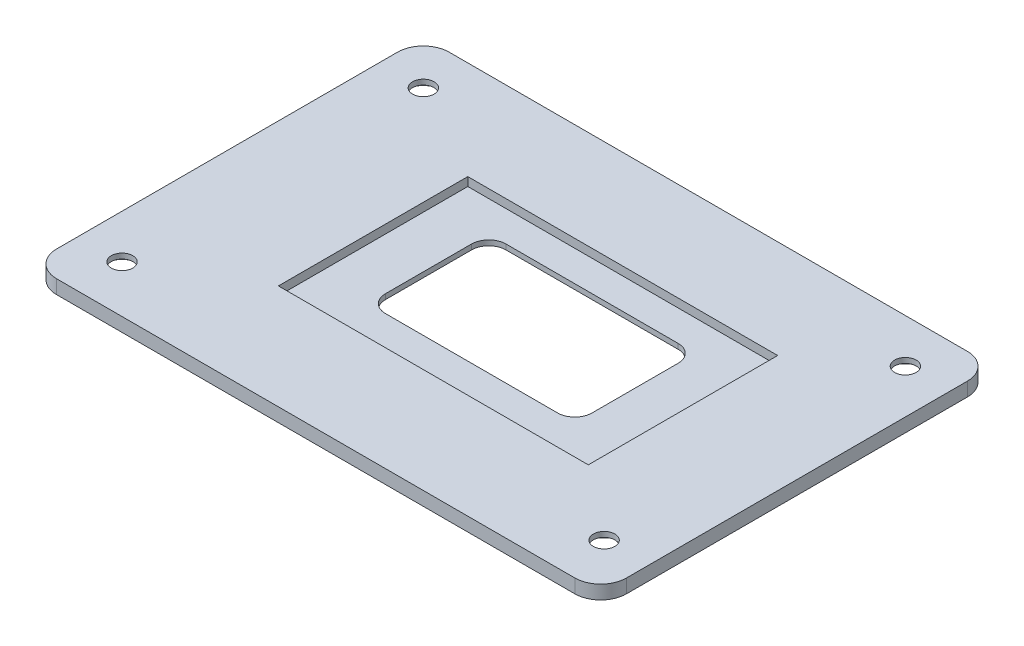
ISO-10303-21;
HEADER;
FILE_DESCRIPTION(('STEP AP214'),'2;1');
FILE_NAME('part.step','',(''),(''),'','','');
FILE_SCHEMA(('AUTOMOTIVE_DESIGN { 1 0 10303 214 1 1 1 1 }'));
ENDSEC;
DATA;
#1=APPLICATION_CONTEXT('core data for automotive mechanical design processes');
#2=APPLICATION_PROTOCOL_DEFINITION('international standard','automotive_design',2000,#1);
#3=PRODUCT_CONTEXT('',#1,'mechanical');
#4=PRODUCT('Part','Part','',(#3));
#5=PRODUCT_RELATED_PRODUCT_CATEGORY('part','',(#4));
#6=PRODUCT_DEFINITION_FORMATION('','',#4);
#7=PRODUCT_DEFINITION_CONTEXT('part definition',#1,'design');
#8=PRODUCT_DEFINITION('design','',#6,#7);
#9=PRODUCT_DEFINITION_SHAPE('','',#8);
#10=(LENGTH_UNIT() NAMED_UNIT(*) SI_UNIT(.MILLI.,.METRE.));
#11=(NAMED_UNIT(*) PLANE_ANGLE_UNIT() SI_UNIT($,.RADIAN.));
#12=(NAMED_UNIT(*) SI_UNIT($,.STERADIAN.) SOLID_ANGLE_UNIT());
#13=UNCERTAINTY_MEASURE_WITH_UNIT(LENGTH_MEASURE(1.E-05),#10,'distance_accuracy_value','');
#14=(GEOMETRIC_REPRESENTATION_CONTEXT(3) GLOBAL_UNCERTAINTY_ASSIGNED_CONTEXT((#13)) GLOBAL_UNIT_ASSIGNED_CONTEXT((#10,
#11,#12)) REPRESENTATION_CONTEXT('',''));
#15=CARTESIAN_POINT('',(0.,0.,0.));
#16=DIRECTION('',(0.,0.,1.));
#17=DIRECTION('',(1.,0.,0.));
#18=AXIS2_PLACEMENT_3D('',#15,#16,#17);
#19=CARTESIAN_POINT('',(30.1,1.6,-19.8));
#20=DIRECTION('',(0.,-1.,0.));
#21=DIRECTION('',(0.,0.,-1.));
#22=AXIS2_PLACEMENT_3D('',#19,#20,#21);
#23=PLANE('',#22);
#24=CARTESIAN_POINT('',(30.1,1.6,-19.8));
#25=DIRECTION('',(0.,1.,0.));
#26=DIRECTION('',(0.,0.,-1.));
#27=AXIS2_PLACEMENT_3D('',#24,#25,#26);
#28=CIRCLE('',#27,3.);
#29=CARTESIAN_POINT('',(33.1,1.6,-19.8));
#30=VERTEX_POINT('',#29);
#31=CARTESIAN_POINT('',(30.1,1.6,-22.8));
#32=VERTEX_POINT('',#31);
#33=EDGE_CURVE('E374',#30,#32,#28,.T.);
#34=ORIENTED_EDGE('',*,*,#33,.T.);
#35=DIRECTION('',(-1.,0.,0.));
#36=VECTOR('',#35,1.);
#37=CARTESIAN_POINT('',(-30.1,1.6,-22.8));
#38=LINE('',#37,#36);
#39=CARTESIAN_POINT('',(-30.1,1.6,-22.8));
#40=VERTEX_POINT('',#39);
#41=EDGE_CURVE('E378',#32,#40,#38,.T.);
#42=ORIENTED_EDGE('',*,*,#41,.T.);
#43=CARTESIAN_POINT('',(-30.1,1.6,-19.8));
#44=DIRECTION('',(0.,1.,0.));
#45=DIRECTION('',(0.,0.,-1.));
#46=AXIS2_PLACEMENT_3D('',#43,#44,#45);
#47=CIRCLE('',#46,3.);
#48=CARTESIAN_POINT('',(-33.1,1.6,-19.8));
#49=VERTEX_POINT('',#48);
#50=EDGE_CURVE('E382',#40,#49,#47,.T.);
#51=ORIENTED_EDGE('',*,*,#50,.T.);
#52=DIRECTION('',(0.,0.,1.));
#53=VECTOR('',#52,1.);
#54=CARTESIAN_POINT('',(-33.1,1.6,19.8));
#55=LINE('',#54,#53);
#56=CARTESIAN_POINT('',(-33.1,1.6,19.8));
#57=VERTEX_POINT('',#56);
#58=EDGE_CURVE('E385',#49,#57,#55,.T.);
#59=ORIENTED_EDGE('',*,*,#58,.T.);
#60=CARTESIAN_POINT('',(-30.1,1.6,19.8));
#61=DIRECTION('',(0.,1.,0.));
#62=DIRECTION('',(0.,0.,-1.));
#63=AXIS2_PLACEMENT_3D('',#60,#61,#62);
#64=CIRCLE('',#63,3.);
#65=CARTESIAN_POINT('',(-30.1,1.6,22.8));
#66=VERTEX_POINT('',#65);
#67=EDGE_CURVE('E388',#57,#66,#64,.T.);
#68=ORIENTED_EDGE('',*,*,#67,.T.);
#69=DIRECTION('',(1.,0.,0.));
#70=VECTOR('',#69,1.);
#71=CARTESIAN_POINT('',(-30.1,1.6,22.8));
#72=LINE('',#71,#70);
#73=CARTESIAN_POINT('',(30.1,1.6,22.8));
#74=VERTEX_POINT('',#73);
#75=EDGE_CURVE('E391',#66,#74,#72,.T.);
#76=ORIENTED_EDGE('',*,*,#75,.T.);
#77=CARTESIAN_POINT('',(30.1,1.6,19.8));
#78=DIRECTION('',(0.,1.,0.));
#79=DIRECTION('',(0.,0.,1.));
#80=AXIS2_PLACEMENT_3D('',#77,#78,#79);
#81=CIRCLE('',#80,3.);
#82=CARTESIAN_POINT('',(33.1,1.6,19.8));
#83=VERTEX_POINT('',#82);
#84=EDGE_CURVE('E394',#74,#83,#81,.T.);
#85=ORIENTED_EDGE('',*,*,#84,.T.);
#86=DIRECTION('',(0.,0.,-1.));
#87=VECTOR('',#86,1.);
#88=CARTESIAN_POINT('',(33.1,1.6,19.8));
#89=LINE('',#88,#87);
#90=EDGE_CURVE('E397',#83,#30,#89,.T.);
#91=ORIENTED_EDGE('',*,*,#90,.T.);
#92=EDGE_LOOP('',(#34,#42,#51,#59,#68,#76,#85,#91));
#93=FACE_BOUND('',#92,.T.);
#94=CARTESIAN_POINT('',(-28.,1.6,-17.7));
#95=DIRECTION('',(0.,-1.,0.));
#96=DIRECTION('',(0.,0.,-1.));
#97=AXIS2_PLACEMENT_3D('',#94,#95,#96);
#98=CIRCLE('',#97,1.25);
#99=CARTESIAN_POINT('',(-28.,1.6,-18.95));
#100=VERTEX_POINT('',#99);
#101=EDGE_CURVE('E273',#100,#100,#98,.F.);
#102=ORIENTED_EDGE('',*,*,#101,.F.);
#103=EDGE_LOOP('',(#102));
#104=FACE_BOUND('',#103,.T.);
#105=CARTESIAN_POINT('',(28.,1.6,-17.7));
#106=DIRECTION('',(0.,-1.,0.));
#107=DIRECTION('',(0.,0.,-1.));
#108=AXIS2_PLACEMENT_3D('',#105,#106,#107);
#109=CIRCLE('',#108,1.25);
#110=CARTESIAN_POINT('',(28.,1.6,-18.95));
#111=VERTEX_POINT('',#110);
#112=EDGE_CURVE('E250',#111,#111,#109,.F.);
#113=ORIENTED_EDGE('',*,*,#112,.F.);
#114=EDGE_LOOP('',(#113));
#115=FACE_BOUND('',#114,.T.);
#116=CARTESIAN_POINT('',(27.9999999999999,1.6,17.3));
#117=DIRECTION('',(0.,-1.,0.));
#118=DIRECTION('',(0.,0.,-1.));
#119=AXIS2_PLACEMENT_3D('',#116,#117,#118);
#120=CIRCLE('',#119,1.25);
#121=CARTESIAN_POINT('',(27.9999999999999,1.6,16.05));
#122=VERTEX_POINT('',#121);
#123=EDGE_CURVE('E251',#122,#122,#120,.F.);
#124=ORIENTED_EDGE('',*,*,#123,.F.);
#125=EDGE_LOOP('',(#124));
#126=FACE_BOUND('',#125,.T.);
#127=CARTESIAN_POINT('',(-28.0000000000001,1.6,17.3));
#128=DIRECTION('',(0.,-1.,0.));
#129=DIRECTION('',(0.,0.,-1.));
#130=AXIS2_PLACEMENT_3D('',#127,#128,#129);
#131=CIRCLE('',#130,1.25);
#132=CARTESIAN_POINT('',(-28.0000000000001,1.6,16.05));
#133=VERTEX_POINT('',#132);
#134=EDGE_CURVE('E260',#133,#133,#131,.F.);
#135=ORIENTED_EDGE('',*,*,#134,.F.);
#136=EDGE_LOOP('',(#135));
#137=FACE_BOUND('',#136,.T.);
#138=DIRECTION('',(1.,0.,0.));
#139=VECTOR('',#138,1.);
#140=CARTESIAN_POINT('',(-16.4990993918296,1.6,-11.3627976285923));
#141=LINE('',#140,#139);
#142=CARTESIAN_POINT('',(-16.4990993918296,1.6,-11.3627976285923));
#143=VERTEX_POINT('',#142);
#144=CARTESIAN_POINT('',(19.5009006081704,1.6,-11.3627976285923));
#145=VERTEX_POINT('',#144);
#146=EDGE_CURVE('E54',#143,#145,#141,.T.);
#147=ORIENTED_EDGE('',*,*,#146,.T.);
#148=DIRECTION('',(0.,0.,-1.));
#149=VECTOR('',#148,1.);
#150=CARTESIAN_POINT('',(19.5009006081704,1.6,10.6372023714077));
#151=LINE('',#150,#149);
#152=CARTESIAN_POINT('',(19.5009006081704,1.6,10.6372023714077));
#153=VERTEX_POINT('',#152);
#154=EDGE_CURVE('E192',#153,#145,#151,.T.);
#155=ORIENTED_EDGE('',*,*,#154,.F.);
#156=DIRECTION('',(1.,0.,0.));
#157=VECTOR('',#156,1.);
#158=CARTESIAN_POINT('',(-16.4990993918296,1.6,10.6372023714077));
#159=LINE('',#158,#157);
#160=CARTESIAN_POINT('',(-16.4990993918296,1.6,10.6372023714077));
#161=VERTEX_POINT('',#160);
#162=EDGE_CURVE('E211',#161,#153,#159,.T.);
#163=ORIENTED_EDGE('',*,*,#162,.F.);
#164=DIRECTION('',(0.,0.,-1.));
#165=VECTOR('',#164,1.);
#166=CARTESIAN_POINT('',(-16.4990993918296,1.6,10.6372023714077));
#167=LINE('',#166,#165);
#168=EDGE_CURVE('E185',#161,#143,#167,.T.);
#169=ORIENTED_EDGE('',*,*,#168,.T.);
#170=EDGE_LOOP('',(#147,#155,#163,#169));
#171=FACE_BOUND('',#170,.T.);
#172=ADVANCED_FACE('F38',(#93,#104,#115,#126,#137,#171),#23,.F.);
#173=CARTESIAN_POINT('',(11.5,-0.000999999999999916,4.2));
#174=DIRECTION('',(0.,1.,0.));
#175=DIRECTION('',(0.,0.,1.));
#176=AXIS2_PLACEMENT_3D('',#173,#174,#175);
#177=CYLINDRICAL_SURFACE('',#176,2.);
#178=CARTESIAN_POINT('',(11.5,0.6,4.2));
#179=DIRECTION('',(0.,1.,0.));
#180=DIRECTION('',(0.,0.,1.));
#181=AXIS2_PLACEMENT_3D('',#178,#179,#180);
#182=CIRCLE('',#181,2.);
#183=CARTESIAN_POINT('',(13.5,0.6,4.2));
#184=VERTEX_POINT('',#183);
#185=CARTESIAN_POINT('',(11.5,0.6,6.2));
#186=VERTEX_POINT('',#185);
#187=EDGE_CURVE('E242',#184,#186,#182,.F.);
#188=ORIENTED_EDGE('',*,*,#187,.F.);
#189=DIRECTION('',(0.,1.,0.));
#190=VECTOR('',#189,1.);
#191=CARTESIAN_POINT('',(13.5,-0.000999999999999916,4.2));
#192=LINE('',#191,#190);
#193=CARTESIAN_POINT('',(13.5,0.,4.2));
#194=VERTEX_POINT('',#193);
#195=EDGE_CURVE('E337',#194,#184,#192,.T.);
#196=ORIENTED_EDGE('',*,*,#195,.F.);
#197=CARTESIAN_POINT('',(11.5,0.,4.2));
#198=DIRECTION('',(0.,-1.,0.));
#199=DIRECTION('',(0.,0.,-1.));
#200=AXIS2_PLACEMENT_3D('',#197,#198,#199);
#201=CIRCLE('',#200,2.);
#202=CARTESIAN_POINT('',(11.5,0.,6.2));
#203=VERTEX_POINT('',#202);
#204=EDGE_CURVE('E333',#203,#194,#201,.F.);
#205=ORIENTED_EDGE('',*,*,#204,.F.);
#206=DIRECTION('',(0.,1.,0.));
#207=VECTOR('',#206,1.);
#208=CARTESIAN_POINT('',(11.5,-0.000999999999999916,6.2));
#209=LINE('',#208,#207);
#210=EDGE_CURVE('E338',#203,#186,#209,.T.);
#211=ORIENTED_EDGE('',*,*,#210,.T.);
#212=EDGE_LOOP('',(#188,#196,#205,#211));
#213=FACE_BOUND('',#212,.T.);
#214=ADVANCED_FACE('F502',(#213),#177,.F.);
#215=CARTESIAN_POINT('',(-8.49999999999999,-0.000999999999999916,6.2));
#216=DIRECTION('',(0.,0.,1.));
#217=DIRECTION('',(1.,0.,0.));
#218=AXIS2_PLACEMENT_3D('',#215,#216,#217);
#219=PLANE('',#218);
#220=DIRECTION('',(-1.,0.,0.));
#221=VECTOR('',#220,1.);
#222=CARTESIAN_POINT('',(-8.49999999999999,0.6,6.2));
#223=LINE('',#222,#221);
#224=CARTESIAN_POINT('',(-8.49999999999999,0.6,6.2));
#225=VERTEX_POINT('',#224);
#226=EDGE_CURVE('E239',#186,#225,#223,.T.);
#227=ORIENTED_EDGE('',*,*,#226,.F.);
#228=ORIENTED_EDGE('',*,*,#210,.F.);
#229=DIRECTION('',(1.,0.,0.));
#230=VECTOR('',#229,1.);
#231=CARTESIAN_POINT('',(-8.49999999999999,0.,6.2));
#232=LINE('',#231,#230);
#233=CARTESIAN_POINT('',(-8.49999999999999,0.,6.2));
#234=VERTEX_POINT('',#233);
#235=EDGE_CURVE('E329',#234,#203,#232,.T.);
#236=ORIENTED_EDGE('',*,*,#235,.F.);
#237=DIRECTION('',(0.,1.,0.));
#238=VECTOR('',#237,1.);
#239=CARTESIAN_POINT('',(-8.49999999999999,-0.000999999999999916,6.2));
#240=LINE('',#239,#238);
#241=EDGE_CURVE('E343',#234,#225,#240,.T.);
#242=ORIENTED_EDGE('',*,*,#241,.T.);
#243=EDGE_LOOP('',(#227,#228,#236,#242));
#244=FACE_BOUND('',#243,.T.);
#245=ADVANCED_FACE('F507',(#244),#219,.F.);
#246=CARTESIAN_POINT('',(-8.49999999999999,-0.000999999999999916,4.2));
#247=DIRECTION('',(0.,1.,0.));
#248=DIRECTION('',(0.,0.,1.));
#249=AXIS2_PLACEMENT_3D('',#246,#247,#248);
#250=CYLINDRICAL_SURFACE('',#249,2.);
#251=CARTESIAN_POINT('',(-8.49999999999999,0.6,4.2));
#252=DIRECTION('',(0.,1.,0.));
#253=DIRECTION('',(0.,0.,1.));
#254=AXIS2_PLACEMENT_3D('',#251,#252,#253);
#255=CIRCLE('',#254,2.);
#256=CARTESIAN_POINT('',(-10.5,0.6,4.2));
#257=VERTEX_POINT('',#256);
#258=EDGE_CURVE('E236',#225,#257,#255,.F.);
#259=ORIENTED_EDGE('',*,*,#258,.F.);
#260=ORIENTED_EDGE('',*,*,#241,.F.);
#261=CARTESIAN_POINT('',(-8.49999999999999,0.,4.2));
#262=DIRECTION('',(0.,-1.,0.));
#263=DIRECTION('',(0.,0.,-1.));
#264=AXIS2_PLACEMENT_3D('',#261,#262,#263);
#265=CIRCLE('',#264,2.);
#266=CARTESIAN_POINT('',(-10.5,0.,4.2));
#267=VERTEX_POINT('',#266);
#268=EDGE_CURVE('E325',#267,#234,#265,.F.);
#269=ORIENTED_EDGE('',*,*,#268,.F.);
#270=DIRECTION('',(0.,1.,0.));
#271=VECTOR('',#270,1.);
#272=CARTESIAN_POINT('',(-10.5,-0.000999999999999916,4.2));
#273=LINE('',#272,#271);
#274=EDGE_CURVE('E347',#267,#257,#273,.T.);
#275=ORIENTED_EDGE('',*,*,#274,.T.);
#276=EDGE_LOOP('',(#259,#260,#269,#275));
#277=FACE_BOUND('',#276,.T.);
#278=ADVANCED_FACE('F688',(#277),#250,.F.);
#279=CARTESIAN_POINT('',(-10.5,-0.000999999999999916,4.2));
#280=DIRECTION('',(-1.,0.,0.));
#281=DIRECTION('',(0.,0.,1.));
#282=AXIS2_PLACEMENT_3D('',#279,#280,#281);
#283=PLANE('',#282);
#284=DIRECTION('',(0.,0.,-1.));
#285=VECTOR('',#284,1.);
#286=CARTESIAN_POINT('',(-10.5,0.6,4.2));
#287=LINE('',#286,#285);
#288=CARTESIAN_POINT('',(-10.5,0.6,-5.8));
#289=VERTEX_POINT('',#288);
#290=EDGE_CURVE('E233',#257,#289,#287,.T.);
#291=ORIENTED_EDGE('',*,*,#290,.F.);
#292=ORIENTED_EDGE('',*,*,#274,.F.);
#293=DIRECTION('',(0.,0.,1.));
#294=VECTOR('',#293,1.);
#295=CARTESIAN_POINT('',(-10.5,0.,4.2));
#296=LINE('',#295,#294);
#297=CARTESIAN_POINT('',(-10.5,0.,-5.8));
#298=VERTEX_POINT('',#297);
#299=EDGE_CURVE('E321',#298,#267,#296,.T.);
#300=ORIENTED_EDGE('',*,*,#299,.F.);
#301=DIRECTION('',(0.,1.,0.));
#302=VECTOR('',#301,1.);
#303=CARTESIAN_POINT('',(-10.5,-0.000999999999999916,-5.8));
#304=LINE('',#303,#302);
#305=EDGE_CURVE('E351',#298,#289,#304,.T.);
#306=ORIENTED_EDGE('',*,*,#305,.T.);
#307=EDGE_LOOP('',(#291,#292,#300,#306));
#308=FACE_BOUND('',#307,.T.);
#309=ADVANCED_FACE('F697',(#308),#283,.F.);
#310=CARTESIAN_POINT('',(-8.49999999999999,-0.000999999999999916,-5.8));
#311=DIRECTION('',(0.,1.,0.));
#312=DIRECTION('',(0.,0.,1.));
#313=AXIS2_PLACEMENT_3D('',#310,#311,#312);
#314=CYLINDRICAL_SURFACE('',#313,2.);
#315=CARTESIAN_POINT('',(-8.49999999999999,0.6,-5.8));
#316=DIRECTION('',(0.,1.,0.));
#317=DIRECTION('',(0.,0.,1.));
#318=AXIS2_PLACEMENT_3D('',#315,#316,#317);
#319=CIRCLE('',#318,2.);
#320=CARTESIAN_POINT('',(-8.49999999999999,0.6,-7.8));
#321=VERTEX_POINT('',#320);
#322=EDGE_CURVE('E230',#289,#321,#319,.F.);
#323=ORIENTED_EDGE('',*,*,#322,.F.);
#324=ORIENTED_EDGE('',*,*,#305,.F.);
#325=CARTESIAN_POINT('',(-8.49999999999999,0.,-5.8));
#326=DIRECTION('',(0.,-1.,0.));
#327=DIRECTION('',(0.,0.,-1.));
#328=AXIS2_PLACEMENT_3D('',#325,#326,#327);
#329=CIRCLE('',#328,2.);
#330=CARTESIAN_POINT('',(-8.49999999999999,0.,-7.8));
#331=VERTEX_POINT('',#330);
#332=EDGE_CURVE('E317',#331,#298,#329,.F.);
#333=ORIENTED_EDGE('',*,*,#332,.F.);
#334=DIRECTION('',(0.,1.,0.));
#335=VECTOR('',#334,1.);
#336=CARTESIAN_POINT('',(-8.49999999999999,-0.000999999999999916,-7.8));
#337=LINE('',#336,#335);
#338=EDGE_CURVE('E355',#331,#321,#337,.T.);
#339=ORIENTED_EDGE('',*,*,#338,.T.);
#340=EDGE_LOOP('',(#323,#324,#333,#339));
#341=FACE_BOUND('',#340,.T.);
#342=ADVANCED_FACE('F706',(#341),#314,.F.);
#343=CARTESIAN_POINT('',(-8.49999999999999,-0.000999999999999916,-7.8));
#344=DIRECTION('',(0.,0.,-1.));
#345=DIRECTION('',(-1.,0.,0.));
#346=AXIS2_PLACEMENT_3D('',#343,#344,#345);
#347=PLANE('',#346);
#348=DIRECTION('',(1.,0.,0.));
#349=VECTOR('',#348,1.);
#350=CARTESIAN_POINT('',(-8.49999999999999,0.6,-7.8));
#351=LINE('',#350,#349);
#352=CARTESIAN_POINT('',(11.5,0.6,-7.8));
#353=VERTEX_POINT('',#352);
#354=EDGE_CURVE('E227',#321,#353,#351,.T.);
#355=ORIENTED_EDGE('',*,*,#354,.F.);
#356=ORIENTED_EDGE('',*,*,#338,.F.);
#357=DIRECTION('',(-1.,0.,0.));
#358=VECTOR('',#357,1.);
#359=CARTESIAN_POINT('',(-8.49999999999999,0.,-7.8));
#360=LINE('',#359,#358);
#361=CARTESIAN_POINT('',(11.5,0.,-7.8));
#362=VERTEX_POINT('',#361);
#363=EDGE_CURVE('E313',#362,#331,#360,.T.);
#364=ORIENTED_EDGE('',*,*,#363,.F.);
#365=DIRECTION('',(0.,1.,0.));
#366=VECTOR('',#365,1.);
#367=CARTESIAN_POINT('',(11.5,-0.000999999999999916,-7.8));
#368=LINE('',#367,#366);
#369=EDGE_CURVE('E359',#362,#353,#368,.T.);
#370=ORIENTED_EDGE('',*,*,#369,.T.);
#371=EDGE_LOOP('',(#355,#356,#364,#370));
#372=FACE_BOUND('',#371,.T.);
#373=ADVANCED_FACE('F715',(#372),#347,.F.);
#374=CARTESIAN_POINT('',(11.5,-0.000999999999999916,-5.8));
#375=DIRECTION('',(0.,1.,0.));
#376=DIRECTION('',(0.,0.,1.));
#377=AXIS2_PLACEMENT_3D('',#374,#375,#376);
#378=CYLINDRICAL_SURFACE('',#377,2.);
#379=CARTESIAN_POINT('',(11.5,0.6,-5.8));
#380=DIRECTION('',(0.,1.,0.));
#381=DIRECTION('',(0.,0.,1.));
#382=AXIS2_PLACEMENT_3D('',#379,#380,#381);
#383=CIRCLE('',#382,2.);
#384=CARTESIAN_POINT('',(13.5,0.6,-5.8));
#385=VERTEX_POINT('',#384);
#386=EDGE_CURVE('E61',#353,#385,#383,.F.);
#387=ORIENTED_EDGE('',*,*,#386,.F.);
#388=ORIENTED_EDGE('',*,*,#369,.F.);
#389=CARTESIAN_POINT('',(11.5,0.,-5.8));
#390=DIRECTION('',(0.,-1.,0.));
#391=DIRECTION('',(0.,0.,-1.));
#392=AXIS2_PLACEMENT_3D('',#389,#390,#391);
#393=CIRCLE('',#392,2.);
#394=CARTESIAN_POINT('',(13.5,0.,-5.8));
#395=VERTEX_POINT('',#394);
#396=EDGE_CURVE('E306',#395,#362,#393,.F.);
#397=ORIENTED_EDGE('',*,*,#396,.F.);
#398=DIRECTION('',(0.,1.,0.));
#399=VECTOR('',#398,1.);
#400=CARTESIAN_POINT('',(13.5,-0.000999999999999916,-5.8));
#401=LINE('',#400,#399);
#402=EDGE_CURVE('E363',#395,#385,#401,.T.);
#403=ORIENTED_EDGE('',*,*,#402,.T.);
#404=EDGE_LOOP('',(#387,#388,#397,#403));
#405=FACE_BOUND('',#404,.T.);
#406=ADVANCED_FACE('F724',(#405),#378,.F.);
#407=CARTESIAN_POINT('',(13.5,-0.000999999999999916,4.2));
#408=DIRECTION('',(1.,0.,0.));
#409=DIRECTION('',(0.,0.,-1.));
#410=AXIS2_PLACEMENT_3D('',#407,#408,#409);
#411=PLANE('',#410);
#412=DIRECTION('',(0.,0.,1.));
#413=VECTOR('',#412,1.);
#414=CARTESIAN_POINT('',(13.5,0.6,4.2));
#415=LINE('',#414,#413);
#416=EDGE_CURVE('E11',#385,#184,#415,.T.);
#417=ORIENTED_EDGE('',*,*,#416,.F.);
#418=ORIENTED_EDGE('',*,*,#402,.F.);
#419=DIRECTION('',(0.,0.,-1.));
#420=VECTOR('',#419,1.);
#421=CARTESIAN_POINT('',(13.5,0.,4.2));
#422=LINE('',#421,#420);
#423=EDGE_CURVE('E342',#194,#395,#422,.T.);
#424=ORIENTED_EDGE('',*,*,#423,.F.);
#425=ORIENTED_EDGE('',*,*,#195,.T.);
#426=EDGE_LOOP('',(#417,#418,#424,#425));
#427=FACE_BOUND('',#426,.T.);
#428=ADVANCED_FACE('F733',(#427),#411,.F.);
#429=CARTESIAN_POINT('',(30.1,1.6,-19.8));
#430=DIRECTION('',(0.,-1.,0.));
#431=DIRECTION('',(0.,0.,-1.));
#432=AXIS2_PLACEMENT_3D('',#429,#430,#431);
#433=CYLINDRICAL_SURFACE('',#432,3.);
#434=CARTESIAN_POINT('',(30.1,0.,-19.8));
#435=DIRECTION('',(0.,1.,0.));
#436=DIRECTION('',(0.,0.,-1.));
#437=AXIS2_PLACEMENT_3D('',#434,#435,#436);
#438=CIRCLE('',#437,3.);
#439=CARTESIAN_POINT('',(33.1,0.,-19.8));
#440=VERTEX_POINT('',#439);
#441=CARTESIAN_POINT('',(30.1,0.,-22.8));
#442=VERTEX_POINT('',#441);
#443=EDGE_CURVE('E373',#440,#442,#438,.T.);
#444=ORIENTED_EDGE('',*,*,#443,.T.);
#445=DIRECTION('',(0.,-1.,0.));
#446=VECTOR('',#445,1.);
#447=CARTESIAN_POINT('',(30.1,1.6,-22.8));
#448=LINE('',#447,#446);
#449=EDGE_CURVE('E47',#32,#442,#448,.T.);
#450=ORIENTED_EDGE('',*,*,#449,.F.);
#451=ORIENTED_EDGE('',*,*,#33,.F.);
#452=DIRECTION('',(0.,-1.,0.));
#453=VECTOR('',#452,1.);
#454=CARTESIAN_POINT('',(33.1,1.6,-19.8));
#455=LINE('',#454,#453);
#456=EDGE_CURVE('E400',#30,#440,#455,.T.);
#457=ORIENTED_EDGE('',*,*,#456,.T.);
#458=EDGE_LOOP('',(#444,#450,#451,#457));
#459=FACE_BOUND('',#458,.T.);
#460=ADVANCED_FACE('F40',(#459),#433,.T.);
#461=CARTESIAN_POINT('',(-30.1,1.6,-22.8));
#462=DIRECTION('',(0.,0.,1.));
#463=DIRECTION('',(1.,0.,0.));
#464=AXIS2_PLACEMENT_3D('',#461,#462,#463);
#465=PLANE('',#464);
#466=DIRECTION('',(-1.,0.,0.));
#467=VECTOR('',#466,1.);
#468=CARTESIAN_POINT('',(-30.1,0.,-22.8));
#469=LINE('',#468,#467);
#470=CARTESIAN_POINT('',(-30.1,0.,-22.8));
#471=VERTEX_POINT('',#470);
#472=EDGE_CURVE('E404',#442,#471,#469,.T.);
#473=ORIENTED_EDGE('',*,*,#472,.T.);
#474=DIRECTION('',(0.,-1.,0.));
#475=VECTOR('',#474,1.);
#476=CARTESIAN_POINT('',(-30.1,1.6,-22.8));
#477=LINE('',#476,#475);
#478=EDGE_CURVE('E447',#40,#471,#477,.T.);
#479=ORIENTED_EDGE('',*,*,#478,.F.);
#480=ORIENTED_EDGE('',*,*,#41,.F.);
#481=ORIENTED_EDGE('',*,*,#449,.T.);
#482=EDGE_LOOP('',(#473,#479,#480,#481));
#483=FACE_BOUND('',#482,.T.);
#484=ADVANCED_FACE('F454',(#483),#465,.F.);
#485=CARTESIAN_POINT('',(-30.1,1.6,-19.8));
#486=DIRECTION('',(0.,-1.,0.));
#487=DIRECTION('',(0.,0.,-1.));
#488=AXIS2_PLACEMENT_3D('',#485,#486,#487);
#489=CYLINDRICAL_SURFACE('',#488,3.);
#490=CARTESIAN_POINT('',(-30.1,0.,-19.8));
#491=DIRECTION('',(0.,1.,0.));
#492=DIRECTION('',(0.,0.,-1.));
#493=AXIS2_PLACEMENT_3D('',#490,#491,#492);
#494=CIRCLE('',#493,3.);
#495=CARTESIAN_POINT('',(-33.1,0.,-19.8));
#496=VERTEX_POINT('',#495);
#497=EDGE_CURVE('E407',#471,#496,#494,.T.);
#498=ORIENTED_EDGE('',*,*,#497,.T.);
#499=DIRECTION('',(0.,-1.,0.));
#500=VECTOR('',#499,1.);
#501=CARTESIAN_POINT('',(-33.1,1.6,-19.8));
#502=LINE('',#501,#500);
#503=EDGE_CURVE('E443',#49,#496,#502,.T.);
#504=ORIENTED_EDGE('',*,*,#503,.F.);
#505=ORIENTED_EDGE('',*,*,#50,.F.);
#506=ORIENTED_EDGE('',*,*,#478,.T.);
#507=EDGE_LOOP('',(#498,#504,#505,#506));
#508=FACE_BOUND('',#507,.T.);
#509=ADVANCED_FACE('F469',(#508),#489,.T.);
#510=CARTESIAN_POINT('',(-33.1,1.6,19.8));
#511=DIRECTION('',(1.,0.,0.));
#512=DIRECTION('',(0.,0.,-1.));
#513=AXIS2_PLACEMENT_3D('',#510,#511,#512);
#514=PLANE('',#513);
#515=DIRECTION('',(0.,0.,1.));
#516=VECTOR('',#515,1.);
#517=CARTESIAN_POINT('',(-33.1,0.,19.8));
#518=LINE('',#517,#516);
#519=CARTESIAN_POINT('',(-33.1,0.,19.8));
#520=VERTEX_POINT('',#519);
#521=EDGE_CURVE('E410',#496,#520,#518,.T.);
#522=ORIENTED_EDGE('',*,*,#521,.T.);
#523=DIRECTION('',(0.,-1.,0.));
#524=VECTOR('',#523,1.);
#525=CARTESIAN_POINT('',(-33.1,1.6,19.8));
#526=LINE('',#525,#524);
#527=EDGE_CURVE('E439',#57,#520,#526,.T.);
#528=ORIENTED_EDGE('',*,*,#527,.F.);
#529=ORIENTED_EDGE('',*,*,#58,.F.);
#530=ORIENTED_EDGE('',*,*,#503,.T.);
#531=EDGE_LOOP('',(#522,#528,#529,#530));
#532=FACE_BOUND('',#531,.T.);
#533=ADVANCED_FACE('F473',(#532),#514,.F.);
#534=CARTESIAN_POINT('',(-30.1,1.6,19.8));
#535=DIRECTION('',(0.,-1.,0.));
#536=DIRECTION('',(0.,0.,-1.));
#537=AXIS2_PLACEMENT_3D('',#534,#535,#536);
#538=CYLINDRICAL_SURFACE('',#537,3.);
#539=CARTESIAN_POINT('',(-30.1,0.,19.8));
#540=DIRECTION('',(0.,1.,0.));
#541=DIRECTION('',(0.,0.,-1.));
#542=AXIS2_PLACEMENT_3D('',#539,#540,#541);
#543=CIRCLE('',#542,3.);
#544=CARTESIAN_POINT('',(-30.1,0.,22.8));
#545=VERTEX_POINT('',#544);
#546=EDGE_CURVE('E413',#520,#545,#543,.T.);
#547=ORIENTED_EDGE('',*,*,#546,.T.);
#548=DIRECTION('',(0.,-1.,0.));
#549=VECTOR('',#548,1.);
#550=CARTESIAN_POINT('',(-30.1,1.6,22.8));
#551=LINE('',#550,#549);
#552=EDGE_CURVE('E435',#66,#545,#551,.T.);
#553=ORIENTED_EDGE('',*,*,#552,.F.);
#554=ORIENTED_EDGE('',*,*,#67,.F.);
#555=ORIENTED_EDGE('',*,*,#527,.T.);
#556=EDGE_LOOP('',(#547,#553,#554,#555));
#557=FACE_BOUND('',#556,.T.);
#558=ADVANCED_FACE('F492',(#557),#538,.T.);
#559=CARTESIAN_POINT('',(-30.1,1.6,22.8));
#560=DIRECTION('',(0.,0.,-1.));
#561=DIRECTION('',(-1.,0.,0.));
#562=AXIS2_PLACEMENT_3D('',#559,#560,#561);
#563=PLANE('',#562);
#564=DIRECTION('',(1.,0.,0.));
#565=VECTOR('',#564,1.);
#566=CARTESIAN_POINT('',(-30.1,0.,22.8));
#567=LINE('',#566,#565);
#568=CARTESIAN_POINT('',(30.1,0.,22.8));
#569=VERTEX_POINT('',#568);
#570=EDGE_CURVE('E416',#545,#569,#567,.T.);
#571=ORIENTED_EDGE('',*,*,#570,.T.);
#572=DIRECTION('',(0.,-1.,0.));
#573=VECTOR('',#572,1.);
#574=CARTESIAN_POINT('',(30.1,1.6,22.8));
#575=LINE('',#574,#573);
#576=EDGE_CURVE('E431',#74,#569,#575,.T.);
#577=ORIENTED_EDGE('',*,*,#576,.F.);
#578=ORIENTED_EDGE('',*,*,#75,.F.);
#579=ORIENTED_EDGE('',*,*,#552,.T.);
#580=EDGE_LOOP('',(#571,#577,#578,#579));
#581=FACE_BOUND('',#580,.T.);
#582=ADVANCED_FACE('F489',(#581),#563,.F.);
#583=CARTESIAN_POINT('',(30.1,1.6,19.8));
#584=DIRECTION('',(0.,-1.,0.));
#585=DIRECTION('',(0.,0.,-1.));
#586=AXIS2_PLACEMENT_3D('',#583,#584,#585);
#587=CYLINDRICAL_SURFACE('',#586,3.);
#588=CARTESIAN_POINT('',(30.1,0.,19.8));
#589=DIRECTION('',(0.,1.,0.));
#590=DIRECTION('',(0.,0.,1.));
#591=AXIS2_PLACEMENT_3D('',#588,#589,#590);
#592=CIRCLE('',#591,3.);
#593=CARTESIAN_POINT('',(33.1,0.,19.8));
#594=VERTEX_POINT('',#593);
#595=EDGE_CURVE('E419',#569,#594,#592,.T.);
#596=ORIENTED_EDGE('',*,*,#595,.T.);
#597=DIRECTION('',(0.,-1.,0.));
#598=VECTOR('',#597,1.);
#599=CARTESIAN_POINT('',(33.1,1.6,19.8));
#600=LINE('',#599,#598);
#601=EDGE_CURVE('E427',#83,#594,#600,.T.);
#602=ORIENTED_EDGE('',*,*,#601,.F.);
#603=ORIENTED_EDGE('',*,*,#84,.F.);
#604=ORIENTED_EDGE('',*,*,#576,.T.);
#605=EDGE_LOOP('',(#596,#602,#603,#604));
#606=FACE_BOUND('',#605,.T.);
#607=ADVANCED_FACE('F485',(#606),#587,.T.);
#608=CARTESIAN_POINT('',(33.1,1.6,19.8));
#609=DIRECTION('',(-1.,0.,0.));
#610=DIRECTION('',(0.,0.,1.));
#611=AXIS2_PLACEMENT_3D('',#608,#609,#610);
#612=PLANE('',#611);
#613=DIRECTION('',(0.,0.,-1.));
#614=VECTOR('',#613,1.);
#615=CARTESIAN_POINT('',(33.1,0.,19.8));
#616=LINE('',#615,#614);
#617=EDGE_CURVE('E379',#594,#440,#616,.T.);
#618=ORIENTED_EDGE('',*,*,#617,.T.);
#619=ORIENTED_EDGE('',*,*,#456,.F.);
#620=ORIENTED_EDGE('',*,*,#90,.F.);
#621=ORIENTED_EDGE('',*,*,#601,.T.);
#622=EDGE_LOOP('',(#618,#619,#620,#621));
#623=FACE_BOUND('',#622,.T.);
#624=ADVANCED_FACE('F483',(#623),#612,.F.);
#625=CARTESIAN_POINT('',(30.1,0.,-19.8));
#626=DIRECTION('',(0.,-1.,0.));
#627=DIRECTION('',(0.,0.,-1.));
#628=AXIS2_PLACEMENT_3D('',#625,#626,#627);
#629=PLANE('',#628);
#630=CARTESIAN_POINT('',(-28.0000000000001,0.,17.3));
#631=DIRECTION('',(0.,-1.,0.));
#632=DIRECTION('',(0.,0.,-1.));
#633=AXIS2_PLACEMENT_3D('',#630,#631,#632);
#634=CIRCLE('',#633,2.6);
#635=CARTESIAN_POINT('',(-28.0000000000001,0.,14.7));
#636=VERTEX_POINT('',#635);
#637=EDGE_CURVE('E277',#636,#636,#634,.T.);
#638=ORIENTED_EDGE('',*,*,#637,.F.);
#639=EDGE_LOOP('',(#638));
#640=FACE_BOUND('',#639,.T.);
#641=CARTESIAN_POINT('',(27.9999999999999,0.,17.3));
#642=DIRECTION('',(0.,-1.,0.));
#643=DIRECTION('',(0.,0.,-1.));
#644=AXIS2_PLACEMENT_3D('',#641,#642,#643);
#645=CIRCLE('',#644,2.6);
#646=CARTESIAN_POINT('',(27.9999999999999,0.,14.7));
#647=VERTEX_POINT('',#646);
#648=EDGE_CURVE('E291',#647,#647,#645,.T.);
#649=ORIENTED_EDGE('',*,*,#648,.F.);
#650=EDGE_LOOP('',(#649));
#651=FACE_BOUND('',#650,.T.);
#652=CARTESIAN_POINT('',(28.,0.,-17.7));
#653=DIRECTION('',(0.,-1.,0.));
#654=DIRECTION('',(0.,0.,-1.));
#655=AXIS2_PLACEMENT_3D('',#652,#653,#654);
#656=CIRCLE('',#655,2.6);
#657=CARTESIAN_POINT('',(28.,0.,-20.3));
#658=VERTEX_POINT('',#657);
#659=EDGE_CURVE('E283',#658,#658,#656,.T.);
#660=ORIENTED_EDGE('',*,*,#659,.F.);
#661=EDGE_LOOP('',(#660));
#662=FACE_BOUND('',#661,.T.);
#663=CARTESIAN_POINT('',(-28.,0.,-17.7));
#664=DIRECTION('',(0.,-1.,0.));
#665=DIRECTION('',(0.,0.,-1.));
#666=AXIS2_PLACEMENT_3D('',#663,#664,#665);
#667=CIRCLE('',#666,2.6);
#668=CARTESIAN_POINT('',(-28.,0.,-20.3));
#669=VERTEX_POINT('',#668);
#670=EDGE_CURVE('E282',#669,#669,#667,.T.);
#671=ORIENTED_EDGE('',*,*,#670,.F.);
#672=EDGE_LOOP('',(#671));
#673=FACE_BOUND('',#672,.T.);
#674=ORIENTED_EDGE('',*,*,#204,.T.);
#675=ORIENTED_EDGE('',*,*,#423,.T.);
#676=ORIENTED_EDGE('',*,*,#396,.T.);
#677=ORIENTED_EDGE('',*,*,#363,.T.);
#678=ORIENTED_EDGE('',*,*,#332,.T.);
#679=ORIENTED_EDGE('',*,*,#299,.T.);
#680=ORIENTED_EDGE('',*,*,#268,.T.);
#681=ORIENTED_EDGE('',*,*,#235,.T.);
#682=EDGE_LOOP('',(#674,#675,#676,#677,#678,#679,#680,#681));
#683=FACE_BOUND('',#682,.T.);
#684=ORIENTED_EDGE('',*,*,#443,.F.);
#685=ORIENTED_EDGE('',*,*,#617,.F.);
#686=ORIENTED_EDGE('',*,*,#595,.F.);
#687=ORIENTED_EDGE('',*,*,#570,.F.);
#688=ORIENTED_EDGE('',*,*,#546,.F.);
#689=ORIENTED_EDGE('',*,*,#521,.F.);
#690=ORIENTED_EDGE('',*,*,#497,.F.);
#691=ORIENTED_EDGE('',*,*,#472,.F.);
#692=EDGE_LOOP('',(#684,#685,#686,#687,#688,#689,#690,#691));
#693=FACE_BOUND('',#692,.T.);
#694=ADVANCED_FACE('F462',(#640,#651,#662,#673,#683,#693),#629,.T.);
#695=CARTESIAN_POINT('',(-28.,1.,-17.7));
#696=DIRECTION('',(0.,-1.,0.));
#697=DIRECTION('',(0.,0.,-1.));
#698=AXIS2_PLACEMENT_3D('',#695,#696,#697);
#699=CYLINDRICAL_SURFACE('',#698,2.6);
#700=CARTESIAN_POINT('',(-28.,1.,-17.7));
#701=DIRECTION('',(0.,-1.,0.));
#702=DIRECTION('',(0.,0.,-1.));
#703=AXIS2_PLACEMENT_3D('',#700,#701,#702);
#704=CIRCLE('',#703,2.6);
#705=CARTESIAN_POINT('',(-28.,1.,-20.3));
#706=VERTEX_POINT('',#705);
#707=EDGE_CURVE('E302',#706,#706,#704,.T.);
#708=ORIENTED_EDGE('',*,*,#707,.F.);
#709=EDGE_LOOP('',(#708));
#710=FACE_BOUND('',#709,.T.);
#711=ORIENTED_EDGE('',*,*,#670,.T.);
#712=EDGE_LOOP('',(#711));
#713=FACE_BOUND('',#712,.T.);
#714=ADVANCED_FACE('F514',(#710,#713),#699,.F.);
#715=CARTESIAN_POINT('',(-28.,1.,-17.7));
#716=DIRECTION('',(0.,-1.,0.));
#717=DIRECTION('',(0.,0.,-1.));
#718=AXIS2_PLACEMENT_3D('',#715,#716,#717);
#719=PLANE('',#718);
#720=CARTESIAN_POINT('',(-28.,1.,-17.7));
#721=DIRECTION('',(0.,-1.,0.));
#722=DIRECTION('',(0.,0.,-1.));
#723=AXIS2_PLACEMENT_3D('',#720,#721,#722);
#724=CIRCLE('',#723,1.25);
#725=CARTESIAN_POINT('',(-28.,1.,-18.95));
#726=VERTEX_POINT('',#725);
#727=EDGE_CURVE('E255',#726,#726,#724,.T.);
#728=ORIENTED_EDGE('',*,*,#727,.F.);
#729=EDGE_LOOP('',(#728));
#730=FACE_BOUND('',#729,.T.);
#731=ORIENTED_EDGE('',*,*,#707,.T.);
#732=EDGE_LOOP('',(#731));
#733=FACE_BOUND('',#732,.T.);
#734=ADVANCED_FACE('F537',(#730,#733),#719,.T.);
#735=CARTESIAN_POINT('',(28.,1.,-17.7));
#736=DIRECTION('',(0.,-1.,0.));
#737=DIRECTION('',(0.,0.,-1.));
#738=AXIS2_PLACEMENT_3D('',#735,#736,#737);
#739=CYLINDRICAL_SURFACE('',#738,2.6);
#740=CARTESIAN_POINT('',(28.,1.,-17.7));
#741=DIRECTION('',(0.,-1.,0.));
#742=DIRECTION('',(0.,0.,-1.));
#743=AXIS2_PLACEMENT_3D('',#740,#741,#742);
#744=CIRCLE('',#743,2.6);
#745=CARTESIAN_POINT('',(28.,1.,-20.3));
#746=VERTEX_POINT('',#745);
#747=EDGE_CURVE('E278',#746,#746,#744,.T.);
#748=ORIENTED_EDGE('',*,*,#747,.F.);
#749=EDGE_LOOP('',(#748));
#750=FACE_BOUND('',#749,.T.);
#751=ORIENTED_EDGE('',*,*,#659,.T.);
#752=EDGE_LOOP('',(#751));
#753=FACE_BOUND('',#752,.T.);
#754=ADVANCED_FACE('F546',(#750,#753),#739,.F.);
#755=CARTESIAN_POINT('',(28.,1.,-17.7));
#756=DIRECTION('',(0.,-1.,0.));
#757=DIRECTION('',(0.,0.,-1.));
#758=AXIS2_PLACEMENT_3D('',#755,#756,#757);
#759=PLANE('',#758);
#760=CARTESIAN_POINT('',(28.,1.,-17.7));
#761=DIRECTION('',(0.,-1.,0.));
#762=DIRECTION('',(0.,0.,-1.));
#763=AXIS2_PLACEMENT_3D('',#760,#761,#762);
#764=CIRCLE('',#763,1.25);
#765=CARTESIAN_POINT('',(28.,1.,-18.95));
#766=VERTEX_POINT('',#765);
#767=EDGE_CURVE('E246',#766,#766,#764,.T.);
#768=ORIENTED_EDGE('',*,*,#767,.F.);
#769=EDGE_LOOP('',(#768));
#770=FACE_BOUND('',#769,.T.);
#771=ORIENTED_EDGE('',*,*,#747,.T.);
#772=EDGE_LOOP('',(#771));
#773=FACE_BOUND('',#772,.T.);
#774=ADVANCED_FACE('F555',(#770,#773),#759,.T.);
#775=CARTESIAN_POINT('',(27.9999999999999,1.,17.3));
#776=DIRECTION('',(0.,-1.,0.));
#777=DIRECTION('',(0.,0.,-1.));
#778=AXIS2_PLACEMENT_3D('',#775,#776,#777);
#779=CYLINDRICAL_SURFACE('',#778,2.6);
#780=CARTESIAN_POINT('',(27.9999999999999,1.,17.3));
#781=DIRECTION('',(0.,-1.,0.));
#782=DIRECTION('',(0.,0.,-1.));
#783=AXIS2_PLACEMENT_3D('',#780,#781,#782);
#784=CIRCLE('',#783,2.6);
#785=CARTESIAN_POINT('',(27.9999999999999,1.,14.7));
#786=VERTEX_POINT('',#785);
#787=EDGE_CURVE('E287',#786,#786,#784,.T.);
#788=ORIENTED_EDGE('',*,*,#787,.F.);
#789=EDGE_LOOP('',(#788));
#790=FACE_BOUND('',#789,.T.);
#791=ORIENTED_EDGE('',*,*,#648,.T.);
#792=EDGE_LOOP('',(#791));
#793=FACE_BOUND('',#792,.T.);
#794=ADVANCED_FACE('F563',(#790,#793),#779,.F.);
#795=CARTESIAN_POINT('',(27.9999999999999,1.,17.3));
#796=DIRECTION('',(0.,-1.,0.));
#797=DIRECTION('',(0.,0.,-1.));
#798=AXIS2_PLACEMENT_3D('',#795,#796,#797);
#799=PLANE('',#798);
#800=CARTESIAN_POINT('',(27.9999999999999,1.,17.3));
#801=DIRECTION('',(0.,-1.,0.));
#802=DIRECTION('',(0.,0.,-1.));
#803=AXIS2_PLACEMENT_3D('',#800,#801,#802);
#804=CIRCLE('',#803,1.25);
#805=CARTESIAN_POINT('',(27.9999999999999,1.,16.05));
#806=VERTEX_POINT('',#805);
#807=EDGE_CURVE('E256',#806,#806,#804,.T.);
#808=ORIENTED_EDGE('',*,*,#807,.F.);
#809=EDGE_LOOP('',(#808));
#810=FACE_BOUND('',#809,.T.);
#811=ORIENTED_EDGE('',*,*,#787,.T.);
#812=EDGE_LOOP('',(#811));
#813=FACE_BOUND('',#812,.T.);
#814=ADVANCED_FACE('F571',(#810,#813),#799,.T.);
#815=CARTESIAN_POINT('',(-28.0000000000001,1.,17.3));
#816=DIRECTION('',(0.,-1.,0.));
#817=DIRECTION('',(0.,0.,-1.));
#818=AXIS2_PLACEMENT_3D('',#815,#816,#817);
#819=CYLINDRICAL_SURFACE('',#818,2.6);
#820=CARTESIAN_POINT('',(-28.0000000000001,1.,17.3));
#821=DIRECTION('',(0.,-1.,0.));
#822=DIRECTION('',(0.,0.,-1.));
#823=AXIS2_PLACEMENT_3D('',#820,#821,#822);
#824=CIRCLE('',#823,2.6);
#825=CARTESIAN_POINT('',(-28.0000000000001,1.,14.7));
#826=VERTEX_POINT('',#825);
#827=EDGE_CURVE('E295',#826,#826,#824,.T.);
#828=ORIENTED_EDGE('',*,*,#827,.F.);
#829=EDGE_LOOP('',(#828));
#830=FACE_BOUND('',#829,.T.);
#831=ORIENTED_EDGE('',*,*,#637,.T.);
#832=EDGE_LOOP('',(#831));
#833=FACE_BOUND('',#832,.T.);
#834=ADVANCED_FACE('F578',(#830,#833),#819,.F.);
#835=CARTESIAN_POINT('',(-28.0000000000001,1.,17.3));
#836=DIRECTION('',(0.,-1.,0.));
#837=DIRECTION('',(0.,0.,-1.));
#838=AXIS2_PLACEMENT_3D('',#835,#836,#837);
#839=PLANE('',#838);
#840=CARTESIAN_POINT('',(-28.0000000000001,1.,17.3));
#841=DIRECTION('',(0.,-1.,0.));
#842=DIRECTION('',(0.,0.,-1.));
#843=AXIS2_PLACEMENT_3D('',#840,#841,#842);
#844=CIRCLE('',#843,1.25);
#845=CARTESIAN_POINT('',(-28.0000000000001,1.,16.05));
#846=VERTEX_POINT('',#845);
#847=EDGE_CURVE('E245',#846,#846,#844,.T.);
#848=ORIENTED_EDGE('',*,*,#847,.F.);
#849=EDGE_LOOP('',(#848));
#850=FACE_BOUND('',#849,.T.);
#851=ORIENTED_EDGE('',*,*,#827,.T.);
#852=EDGE_LOOP('',(#851));
#853=FACE_BOUND('',#852,.T.);
#854=ADVANCED_FACE('F586',(#850,#853),#839,.T.);
#855=CARTESIAN_POINT('',(-28.,1.601,-17.7));
#856=DIRECTION('',(0.,-1.,0.));
#857=DIRECTION('',(0.,0.,-1.));
#858=AXIS2_PLACEMENT_3D('',#855,#856,#857);
#859=CYLINDRICAL_SURFACE('',#858,1.25);
#860=ORIENTED_EDGE('',*,*,#727,.T.);
#861=EDGE_LOOP('',(#860));
#862=FACE_BOUND('',#861,.T.);
#863=ORIENTED_EDGE('',*,*,#101,.T.);
#864=EDGE_LOOP('',(#863));
#865=FACE_BOUND('',#864,.T.);
#866=ADVANCED_FACE('F593',(#862,#865),#859,.F.);
#867=CARTESIAN_POINT('',(28.,1.601,-17.7));
#868=DIRECTION('',(0.,-1.,0.));
#869=DIRECTION('',(0.,0.,-1.));
#870=AXIS2_PLACEMENT_3D('',#867,#868,#869);
#871=CYLINDRICAL_SURFACE('',#870,1.25);
#872=ORIENTED_EDGE('',*,*,#767,.T.);
#873=EDGE_LOOP('',(#872));
#874=FACE_BOUND('',#873,.T.);
#875=ORIENTED_EDGE('',*,*,#112,.T.);
#876=EDGE_LOOP('',(#875));
#877=FACE_BOUND('',#876,.T.);
#878=ADVANCED_FACE('F601',(#874,#877),#871,.F.);
#879=CARTESIAN_POINT('',(27.9999999999999,1.601,17.3));
#880=DIRECTION('',(0.,-1.,0.));
#881=DIRECTION('',(0.,0.,-1.));
#882=AXIS2_PLACEMENT_3D('',#879,#880,#881);
#883=CYLINDRICAL_SURFACE('',#882,1.25);
#884=ORIENTED_EDGE('',*,*,#807,.T.);
#885=EDGE_LOOP('',(#884));
#886=FACE_BOUND('',#885,.T.);
#887=ORIENTED_EDGE('',*,*,#123,.T.);
#888=EDGE_LOOP('',(#887));
#889=FACE_BOUND('',#888,.T.);
#890=ADVANCED_FACE('F609',(#886,#889),#883,.F.);
#891=CARTESIAN_POINT('',(-28.0000000000001,1.601,17.3));
#892=DIRECTION('',(0.,-1.,0.));
#893=DIRECTION('',(0.,0.,-1.));
#894=AXIS2_PLACEMENT_3D('',#891,#892,#893);
#895=CYLINDRICAL_SURFACE('',#894,1.25);
#896=ORIENTED_EDGE('',*,*,#847,.T.);
#897=EDGE_LOOP('',(#896));
#898=FACE_BOUND('',#897,.T.);
#899=ORIENTED_EDGE('',*,*,#134,.T.);
#900=EDGE_LOOP('',(#899));
#901=FACE_BOUND('',#900,.T.);
#902=ADVANCED_FACE('F617',(#898,#901),#895,.F.);
#903=CARTESIAN_POINT('',(0.,0.6,0.));
#904=DIRECTION('',(0.,1.,0.));
#905=DIRECTION('',(0.,0.,1.));
#906=AXIS2_PLACEMENT_3D('',#903,#904,#905);
#907=PLANE('',#906);
#908=DIRECTION('',(1.,0.,0.));
#909=VECTOR('',#908,1.);
#910=CARTESIAN_POINT('',(-16.4990993918296,0.6,-11.3627976285923));
#911=LINE('',#910,#909);
#912=CARTESIAN_POINT('',(-16.4990993918296,0.6,-11.3627976285923));
#913=VERTEX_POINT('',#912);
#914=CARTESIAN_POINT('',(19.5009006081704,0.6,-11.3627976285923));
#915=VERTEX_POINT('',#914);
#916=EDGE_CURVE('E174',#913,#915,#911,.T.);
#917=ORIENTED_EDGE('',*,*,#916,.F.);
#918=DIRECTION('',(0.,0.,-1.));
#919=VECTOR('',#918,1.);
#920=CARTESIAN_POINT('',(-16.4990993918296,0.6,10.6372023714077));
#921=LINE('',#920,#919);
#922=CARTESIAN_POINT('',(-16.4990993918296,0.6,10.6372023714077));
#923=VERTEX_POINT('',#922);
#924=EDGE_CURVE('E202',#923,#913,#921,.T.);
#925=ORIENTED_EDGE('',*,*,#924,.F.);
#926=DIRECTION('',(1.,0.,0.));
#927=VECTOR('',#926,1.);
#928=CARTESIAN_POINT('',(-16.4990993918296,0.6,10.6372023714077));
#929=LINE('',#928,#927);
#930=CARTESIAN_POINT('',(19.5009006081704,0.6,10.6372023714077));
#931=VERTEX_POINT('',#930);
#932=EDGE_CURVE('E198',#923,#931,#929,.T.);
#933=ORIENTED_EDGE('',*,*,#932,.T.);
#934=DIRECTION('',(0.,0.,-1.));
#935=VECTOR('',#934,1.);
#936=CARTESIAN_POINT('',(19.5009006081704,0.6,10.6372023714077));
#937=LINE('',#936,#935);
#938=EDGE_CURVE('E184',#931,#915,#937,.T.);
#939=ORIENTED_EDGE('',*,*,#938,.T.);
#940=EDGE_LOOP('',(#917,#925,#933,#939));
#941=FACE_BOUND('',#940,.T.);
#942=ORIENTED_EDGE('',*,*,#187,.T.);
#943=ORIENTED_EDGE('',*,*,#226,.T.);
#944=ORIENTED_EDGE('',*,*,#258,.T.);
#945=ORIENTED_EDGE('',*,*,#290,.T.);
#946=ORIENTED_EDGE('',*,*,#322,.T.);
#947=ORIENTED_EDGE('',*,*,#354,.T.);
#948=ORIENTED_EDGE('',*,*,#386,.T.);
#949=ORIENTED_EDGE('',*,*,#416,.T.);
#950=EDGE_LOOP('',(#942,#943,#944,#945,#946,#947,#948,#949));
#951=FACE_BOUND('',#950,.T.);
#952=ADVANCED_FACE('F196',(#941,#951),#907,.T.);
#953=CARTESIAN_POINT('',(-16.4990993918296,0.6,-11.3627976285923));
#954=DIRECTION('',(0.,0.,1.));
#955=DIRECTION('',(1.,0.,0.));
#956=AXIS2_PLACEMENT_3D('',#953,#954,#955);
#957=PLANE('',#956);
#958=ORIENTED_EDGE('',*,*,#146,.F.);
#959=DIRECTION('',(0.,1.,0.));
#960=VECTOR('',#959,1.);
#961=CARTESIAN_POINT('',(-16.4990993918296,0.6,-11.3627976285923));
#962=LINE('',#961,#960);
#963=EDGE_CURVE('E179',#913,#143,#962,.T.);
#964=ORIENTED_EDGE('',*,*,#963,.F.);
#965=ORIENTED_EDGE('',*,*,#916,.T.);
#966=DIRECTION('',(0.,1.,0.));
#967=VECTOR('',#966,1.);
#968=CARTESIAN_POINT('',(19.5009006081704,0.6,-11.3627976285923));
#969=LINE('',#968,#967);
#970=EDGE_CURVE('E177',#915,#145,#969,.T.);
#971=ORIENTED_EDGE('',*,*,#970,.T.);
#972=EDGE_LOOP('',(#958,#964,#965,#971));
#973=FACE_BOUND('',#972,.T.);
#974=ADVANCED_FACE('F176',(#973),#957,.T.);
#975=CARTESIAN_POINT('',(19.5009006081704,0.6,10.6372023714077));
#976=DIRECTION('',(1.,0.,0.));
#977=DIRECTION('',(0.,0.,-1.));
#978=AXIS2_PLACEMENT_3D('',#975,#976,#977);
#979=PLANE('',#978);
#980=ORIENTED_EDGE('',*,*,#154,.T.);
#981=ORIENTED_EDGE('',*,*,#970,.F.);
#982=ORIENTED_EDGE('',*,*,#938,.F.);
#983=DIRECTION('',(0.,1.,0.));
#984=VECTOR('',#983,1.);
#985=CARTESIAN_POINT('',(19.5009006081704,0.6,10.6372023714077));
#986=LINE('',#985,#984);
#987=EDGE_CURVE('E194',#931,#153,#986,.T.);
#988=ORIENTED_EDGE('',*,*,#987,.T.);
#989=EDGE_LOOP('',(#980,#981,#982,#988));
#990=FACE_BOUND('',#989,.T.);
#991=ADVANCED_FACE('F189',(#990),#979,.F.);
#992=CARTESIAN_POINT('',(-16.4990993918296,0.6,10.6372023714077));
#993=DIRECTION('',(0.,0.,1.));
#994=DIRECTION('',(1.,0.,0.));
#995=AXIS2_PLACEMENT_3D('',#992,#993,#994);
#996=PLANE('',#995);
#997=ORIENTED_EDGE('',*,*,#162,.T.);
#998=ORIENTED_EDGE('',*,*,#987,.F.);
#999=ORIENTED_EDGE('',*,*,#932,.F.);
#1000=DIRECTION('',(0.,1.,0.));
#1001=VECTOR('',#1000,1.);
#1002=CARTESIAN_POINT('',(-16.4990993918296,0.6,10.6372023714077));
#1003=LINE('',#1002,#1001);
#1004=EDGE_CURVE('E220',#923,#161,#1003,.T.);
#1005=ORIENTED_EDGE('',*,*,#1004,.T.);
#1006=EDGE_LOOP('',(#997,#998,#999,#1005));
#1007=FACE_BOUND('',#1006,.T.);
#1008=ADVANCED_FACE('F645',(#1007),#996,.F.);
#1009=CARTESIAN_POINT('',(-16.4990993918296,0.6,10.6372023714077));
#1010=DIRECTION('',(1.,0.,0.));
#1011=DIRECTION('',(0.,0.,-1.));
#1012=AXIS2_PLACEMENT_3D('',#1009,#1010,#1011);
#1013=PLANE('',#1012);
#1014=ORIENTED_EDGE('',*,*,#168,.F.);
#1015=ORIENTED_EDGE('',*,*,#1004,.F.);
#1016=ORIENTED_EDGE('',*,*,#924,.T.);
#1017=ORIENTED_EDGE('',*,*,#963,.T.);
#1018=EDGE_LOOP('',(#1014,#1015,#1016,#1017));
#1019=FACE_BOUND('',#1018,.T.);
#1020=ADVANCED_FACE('F652',(#1019),#1013,.T.);
#1021=CLOSED_SHELL('',(#172,#214,#245,#278,#309,#342,#373,#406,#428,#460,#484,#509,#533,#558,
#582,#607,#624,#694,#714,#734,#754,#774,#794,#814,#834,#854,#866,#878,#890,#902,#952,#974,#991,
#1008,#1020));
#1022=MANIFOLD_SOLID_BREP('B2',#1021);
#1023=ADVANCED_BREP_SHAPE_REPRESENTATION('',(#18,#1022),#14);
#1024=SHAPE_DEFINITION_REPRESENTATION(#9,#1023);
ENDSEC;
END-ISO-10303-21;
